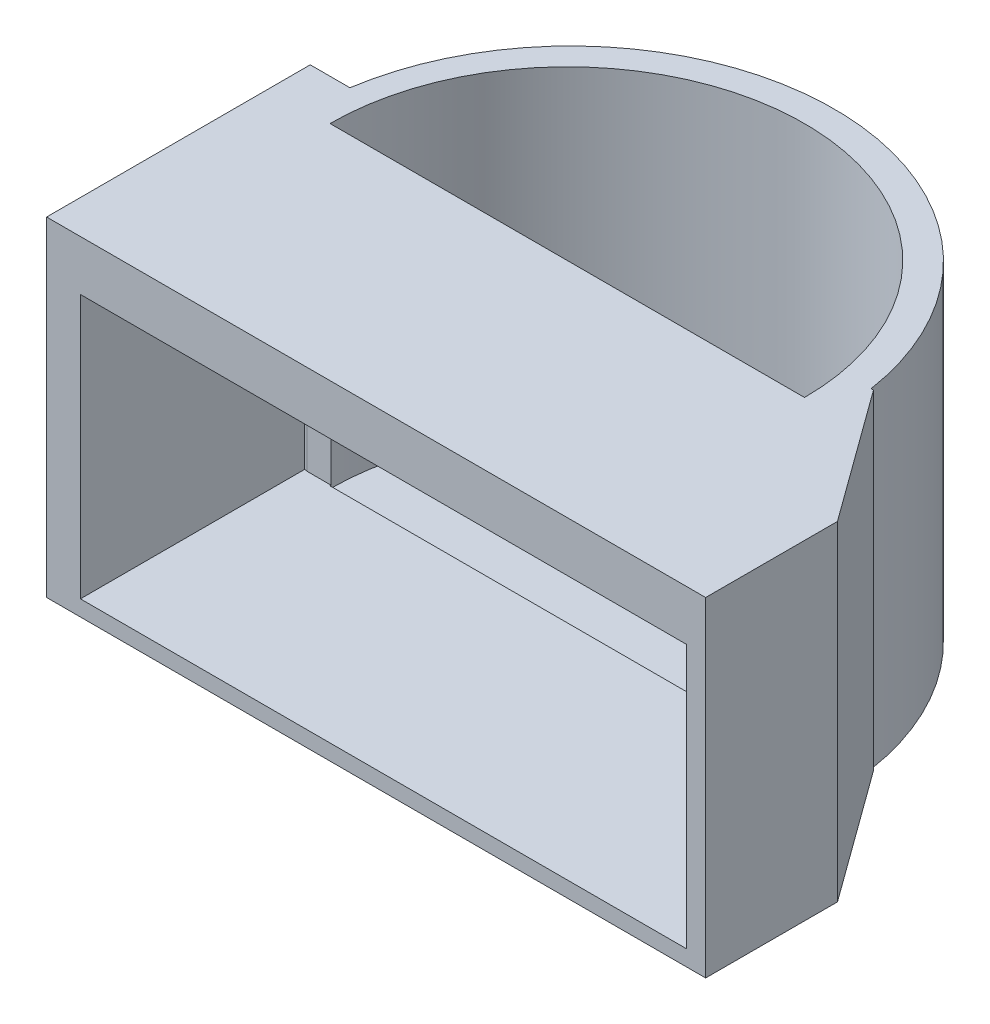
ISO-10303-21;
HEADER;
FILE_DESCRIPTION(('STEP AP214'),'2;1');
FILE_NAME('part.step','',(''),(''),'','','');
FILE_SCHEMA(('AUTOMOTIVE_DESIGN { 1 0 10303 214 1 1 1 1 }'));
ENDSEC;
DATA;
#1=APPLICATION_CONTEXT('core data for automotive mechanical design processes');
#2=APPLICATION_PROTOCOL_DEFINITION('international standard','automotive_design',2000,#1);
#3=PRODUCT_CONTEXT('',#1,'mechanical');
#4=PRODUCT('Part','Part','',(#3));
#5=PRODUCT_RELATED_PRODUCT_CATEGORY('part','',(#4));
#6=PRODUCT_DEFINITION_FORMATION('','',#4);
#7=PRODUCT_DEFINITION_CONTEXT('part definition',#1,'design');
#8=PRODUCT_DEFINITION('design','',#6,#7);
#9=PRODUCT_DEFINITION_SHAPE('','',#8);
#10=(LENGTH_UNIT() NAMED_UNIT(*) SI_UNIT(.MILLI.,.METRE.));
#11=(NAMED_UNIT(*) PLANE_ANGLE_UNIT() SI_UNIT($,.RADIAN.));
#12=(NAMED_UNIT(*) SI_UNIT($,.STERADIAN.) SOLID_ANGLE_UNIT());
#13=UNCERTAINTY_MEASURE_WITH_UNIT(LENGTH_MEASURE(1.E-05),#10,'distance_accuracy_value','');
#14=(GEOMETRIC_REPRESENTATION_CONTEXT(3) GLOBAL_UNCERTAINTY_ASSIGNED_CONTEXT((#13)) GLOBAL_UNIT_ASSIGNED_CONTEXT((#10,
#11,#12)) REPRESENTATION_CONTEXT('',''));
#15=CARTESIAN_POINT('',(0.,0.,0.));
#16=DIRECTION('',(0.,0.,1.));
#17=DIRECTION('',(1.,0.,0.));
#18=AXIS2_PLACEMENT_3D('',#15,#16,#17);
#19=CARTESIAN_POINT('',(-22.2170438921533,25.,-6.97627056206323));
#20=DIRECTION('',(0.,0.,1.));
#21=DIRECTION('',(1.,0.,0.));
#22=AXIS2_PLACEMENT_3D('',#19,#20,#21);
#23=PLANE('',#22);
#24=DIRECTION('',(-1.,0.,0.));
#25=VECTOR('',#24,1.);
#26=CARTESIAN_POINT('',(23.5649533214157,1.19361020714787,-6.97627056206323));
#27=LINE('',#26,#25);
#28=CARTESIAN_POINT('',(16.3167684871887,1.19361020714787,-6.97627056206323));
#29=VERTEX_POINT('',#28);
#30=CARTESIAN_POINT('',(15.6079428709197,1.19361020714787,-6.97627056206323));
#31=VERTEX_POINT('',#30);
#32=EDGE_CURVE('E298',#29,#31,#27,.T.);
#33=ORIENTED_EDGE('',*,*,#32,.F.);
#34=DIRECTION('',(0.,-1.,0.));
#35=VECTOR('',#34,1.);
#36=CARTESIAN_POINT('',(16.3167684871887,25.,-6.97627056206323));
#37=LINE('',#36,#35);
#38=CARTESIAN_POINT('',(16.3167684871887,21.1936102071479,-6.97627056206323));
#39=VERTEX_POINT('',#38);
#40=EDGE_CURVE('E11',#29,#39,#37,.F.);
#41=ORIENTED_EDGE('',*,*,#40,.T.);
#42=DIRECTION('',(1.,0.,0.));
#43=VECTOR('',#42,1.);
#44=CARTESIAN_POINT('',(23.5649533214157,21.1936102071479,-6.97627056206323));
#45=LINE('',#44,#43);
#46=CARTESIAN_POINT('',(15.6079428709197,21.1936102071479,-6.97627056206323));
#47=VERTEX_POINT('',#46);
#48=EDGE_CURVE('E233',#47,#39,#45,.T.);
#49=ORIENTED_EDGE('',*,*,#48,.F.);
#50=DIRECTION('',(0.,1.,0.));
#51=VECTOR('',#50,1.);
#52=CARTESIAN_POINT('',(15.6079428709197,1.,-6.97627056206323));
#53=LINE('',#52,#51);
#54=EDGE_CURVE('E302',#31,#47,#53,.T.);
#55=ORIENTED_EDGE('',*,*,#54,.F.);
#56=EDGE_LOOP('',(#33,#41,#49,#55));
#57=FACE_BOUND('',#56,.T.);
#58=ADVANCED_FACE('F39',(#57),#23,.T.);
#59=CARTESIAN_POINT('',(-25.,25.,-10.));
#60=DIRECTION('',(0.,0.,1.));
#61=DIRECTION('',(1.,0.,0.));
#62=AXIS2_PLACEMENT_3D('',#59,#60,#61);
#63=PLANE('',#62);
#64=DIRECTION('',(-1.,0.,0.));
#65=VECTOR('',#64,1.);
#66=CARTESIAN_POINT('',(-25.,25.,-10.));
#67=LINE('',#66,#65);
#68=CARTESIAN_POINT('',(-21.9871491090244,25.,-10.));
#69=VERTEX_POINT('',#68);
#70=CARTESIAN_POINT('',(-25.,25.,-10.));
#71=VERTEX_POINT('',#70);
#72=EDGE_CURVE('E269',#69,#71,#67,.T.);
#73=ORIENTED_EDGE('',*,*,#72,.F.);
#74=DIRECTION('',(0.,-1.,0.));
#75=VECTOR('',#74,1.);
#76=CARTESIAN_POINT('',(-21.9871491090244,25.,-10.));
#77=LINE('',#76,#75);
#78=CARTESIAN_POINT('',(-21.9871491090244,0.,-10.));
#79=VERTEX_POINT('',#78);
#80=EDGE_CURVE('E230',#69,#79,#77,.T.);
#81=ORIENTED_EDGE('',*,*,#80,.T.);
#82=DIRECTION('',(-1.,0.,0.));
#83=VECTOR('',#82,1.);
#84=CARTESIAN_POINT('',(-25.,0.,-10.));
#85=LINE('',#84,#83);
#86=CARTESIAN_POINT('',(-25.,0.,-10.));
#87=VERTEX_POINT('',#86);
#88=EDGE_CURVE('E280',#79,#87,#85,.T.);
#89=ORIENTED_EDGE('',*,*,#88,.T.);
#90=DIRECTION('',(0.,-1.,0.));
#91=VECTOR('',#90,1.);
#92=CARTESIAN_POINT('',(-25.,25.,-10.));
#93=LINE('',#92,#91);
#94=EDGE_CURVE('E291',#71,#87,#93,.T.);
#95=ORIENTED_EDGE('',*,*,#94,.F.);
#96=EDGE_LOOP('',(#73,#81,#89,#95));
#97=FACE_BOUND('',#96,.T.);
#98=ADVANCED_FACE('F377',(#97),#63,.F.);
#99=CARTESIAN_POINT('',(25.,25.,10.));
#100=DIRECTION('',(-1.,0.,0.));
#101=DIRECTION('',(0.,0.,1.));
#102=AXIS2_PLACEMENT_3D('',#99,#100,#101);
#103=PLANE('',#102);
#104=DIRECTION('',(0.,0.,-1.));
#105=VECTOR('',#104,1.);
#106=CARTESIAN_POINT('',(25.,0.,10.));
#107=LINE('',#106,#105);
#108=CARTESIAN_POINT('',(25.,0.,10.));
#109=VERTEX_POINT('',#108);
#110=CARTESIAN_POINT('',(25.,0.,0.));
#111=VERTEX_POINT('',#110);
#112=EDGE_CURVE('E259',#109,#111,#107,.T.);
#113=ORIENTED_EDGE('',*,*,#112,.T.);
#114=DIRECTION('',(0.,1.,0.));
#115=VECTOR('',#114,1.);
#116=CARTESIAN_POINT('',(25.,25.,0.));
#117=LINE('',#116,#115);
#118=CARTESIAN_POINT('',(25.,25.,0.));
#119=VERTEX_POINT('',#118);
#120=EDGE_CURVE('E311',#111,#119,#117,.T.);
#121=ORIENTED_EDGE('',*,*,#120,.T.);
#122=DIRECTION('',(0.,0.,-1.));
#123=VECTOR('',#122,1.);
#124=CARTESIAN_POINT('',(25.,25.,10.));
#125=LINE('',#124,#123);
#126=CARTESIAN_POINT('',(25.,25.,10.));
#127=VERTEX_POINT('',#126);
#128=EDGE_CURVE('E266',#127,#119,#125,.T.);
#129=ORIENTED_EDGE('',*,*,#128,.F.);
#130=DIRECTION('',(0.,-1.,0.));
#131=VECTOR('',#130,1.);
#132=CARTESIAN_POINT('',(25.,25.,10.));
#133=LINE('',#132,#131);
#134=EDGE_CURVE('E277',#127,#109,#133,.T.);
#135=ORIENTED_EDGE('',*,*,#134,.T.);
#136=EDGE_LOOP('',(#113,#121,#129,#135));
#137=FACE_BOUND('',#136,.T.);
#138=ADVANCED_FACE('F382',(#137),#103,.F.);
#139=CARTESIAN_POINT('',(17.7345747199464,25.,-10.));
#140=VERTEX_POINT('',#139);
#141=CARTESIAN_POINT('',(17.5530613247178,25.,-10.));
#142=VERTEX_POINT('',#141);
#143=EDGE_CURVE('E271',#140,#142,#67,.T.);
#144=ORIENTED_EDGE('',*,*,#143,.F.);
#145=DIRECTION('',(0.,-1.,0.));
#146=VECTOR('',#145,1.);
#147=CARTESIAN_POINT('',(17.7345747199464,25.,-10.));
#148=LINE('',#147,#146);
#149=CARTESIAN_POINT('',(17.7345747199464,0.,-10.));
#150=VERTEX_POINT('',#149);
#151=EDGE_CURVE('E306',#140,#150,#148,.T.);
#152=ORIENTED_EDGE('',*,*,#151,.T.);
#153=CARTESIAN_POINT('',(17.5530613247178,0.,-10.));
#154=VERTEX_POINT('',#153);
#155=EDGE_CURVE('E281',#150,#154,#85,.T.);
#156=ORIENTED_EDGE('',*,*,#155,.T.);
#157=DIRECTION('',(0.,-1.,0.));
#158=VECTOR('',#157,1.);
#159=CARTESIAN_POINT('',(17.5530613247178,25.,-10.));
#160=LINE('',#159,#158);
#161=EDGE_CURVE('E227',#154,#142,#160,.F.);
#162=ORIENTED_EDGE('',*,*,#161,.T.);
#163=EDGE_LOOP('',(#144,#152,#156,#162));
#164=FACE_BOUND('',#163,.T.);
#165=ADVANCED_FACE('F385',(#164),#63,.F.);
#166=CARTESIAN_POINT('',(-25.,25.,10.));
#167=DIRECTION('',(1.,0.,0.));
#168=DIRECTION('',(0.,0.,-1.));
#169=AXIS2_PLACEMENT_3D('',#166,#167,#168);
#170=PLANE('',#169);
#171=DIRECTION('',(0.,0.,1.));
#172=VECTOR('',#171,1.);
#173=CARTESIAN_POINT('',(-25.,0.,10.));
#174=LINE('',#173,#172);
#175=CARTESIAN_POINT('',(-25.,0.,10.));
#176=VERTEX_POINT('',#175);
#177=EDGE_CURVE('E283',#87,#176,#174,.T.);
#178=ORIENTED_EDGE('',*,*,#177,.T.);
#179=DIRECTION('',(0.,-1.,0.));
#180=VECTOR('',#179,1.);
#181=CARTESIAN_POINT('',(-25.,25.,10.));
#182=LINE('',#181,#180);
#183=CARTESIAN_POINT('',(-25.,25.,10.));
#184=VERTEX_POINT('',#183);
#185=EDGE_CURVE('E288',#184,#176,#182,.T.);
#186=ORIENTED_EDGE('',*,*,#185,.F.);
#187=DIRECTION('',(0.,0.,1.));
#188=VECTOR('',#187,1.);
#189=CARTESIAN_POINT('',(-25.,25.,10.));
#190=LINE('',#189,#188);
#191=EDGE_CURVE('E273',#71,#184,#190,.T.);
#192=ORIENTED_EDGE('',*,*,#191,.F.);
#193=ORIENTED_EDGE('',*,*,#94,.T.);
#194=EDGE_LOOP('',(#178,#186,#192,#193));
#195=FACE_BOUND('',#194,.T.);
#196=ADVANCED_FACE('F484',(#195),#170,.F.);
#197=CARTESIAN_POINT('',(-25.,25.,10.));
#198=DIRECTION('',(0.,0.,-1.));
#199=DIRECTION('',(-1.,0.,0.));
#200=AXIS2_PLACEMENT_3D('',#197,#198,#199);
#201=PLANE('',#200);
#202=DIRECTION('',(1.,0.,0.));
#203=VECTOR('',#202,1.);
#204=CARTESIAN_POINT('',(23.5649533214157,1.19361020714787,10.));
#205=LINE('',#204,#203);
#206=CARTESIAN_POINT('',(-22.4350466785843,1.19361020714787,10.));
#207=VERTEX_POINT('',#206);
#208=CARTESIAN_POINT('',(23.5649533214157,1.19361020714787,10.));
#209=VERTEX_POINT('',#208);
#210=EDGE_CURVE('E249',#207,#209,#205,.T.);
#211=ORIENTED_EDGE('',*,*,#210,.F.);
#212=DIRECTION('',(0.,-1.,0.));
#213=VECTOR('',#212,1.);
#214=CARTESIAN_POINT('',(-22.4350466785843,21.1936102071479,10.));
#215=LINE('',#214,#213);
#216=CARTESIAN_POINT('',(-22.4350466785843,21.1936102071479,10.));
#217=VERTEX_POINT('',#216);
#218=EDGE_CURVE('E237',#217,#207,#215,.T.);
#219=ORIENTED_EDGE('',*,*,#218,.F.);
#220=DIRECTION('',(-1.,0.,0.));
#221=VECTOR('',#220,1.);
#222=CARTESIAN_POINT('',(23.5649533214157,21.1936102071479,10.));
#223=LINE('',#222,#221);
#224=CARTESIAN_POINT('',(23.5649533214157,21.1936102071479,10.));
#225=VERTEX_POINT('',#224);
#226=EDGE_CURVE('E242',#225,#217,#223,.T.);
#227=ORIENTED_EDGE('',*,*,#226,.F.);
#228=DIRECTION('',(0.,1.,0.));
#229=VECTOR('',#228,1.);
#230=CARTESIAN_POINT('',(23.5649533214157,21.1936102071479,10.));
#231=LINE('',#230,#229);
#232=EDGE_CURVE('E252',#209,#225,#231,.T.);
#233=ORIENTED_EDGE('',*,*,#232,.F.);
#234=EDGE_LOOP('',(#211,#219,#227,#233));
#235=FACE_BOUND('',#234,.T.);
#236=DIRECTION('',(1.,0.,0.));
#237=VECTOR('',#236,1.);
#238=CARTESIAN_POINT('',(-25.,0.,10.));
#239=LINE('',#238,#237);
#240=EDGE_CURVE('E270',#176,#109,#239,.T.);
#241=ORIENTED_EDGE('',*,*,#240,.T.);
#242=ORIENTED_EDGE('',*,*,#134,.F.);
#243=DIRECTION('',(1.,0.,0.));
#244=VECTOR('',#243,1.);
#245=CARTESIAN_POINT('',(-25.,25.,10.));
#246=LINE('',#245,#244);
#247=EDGE_CURVE('E275',#184,#127,#246,.T.);
#248=ORIENTED_EDGE('',*,*,#247,.F.);
#249=ORIENTED_EDGE('',*,*,#185,.T.);
#250=EDGE_LOOP('',(#241,#242,#248,#249));
#251=FACE_BOUND('',#250,.T.);
#252=ADVANCED_FACE('F329',(#235,#251),#201,.F.);
#253=CARTESIAN_POINT('',(0.,25.,0.));
#254=DIRECTION('',(0.,-1.,0.));
#255=DIRECTION('',(0.,0.,-1.));
#256=AXIS2_PLACEMENT_3D('',#253,#254,#255);
#257=PLANE('',#256);
#258=DIRECTION('',(1.,0.,0.));
#259=VECTOR('',#258,1.);
#260=CARTESIAN_POINT('',(-20.3918641927074,25.,-6.89292986253043));
#261=LINE('',#260,#259);
#262=CARTESIAN_POINT('',(-20.3918641927074,25.,-6.89292986253043));
#263=VERTEX_POINT('',#262);
#264=CARTESIAN_POINT('',(15.6081358072926,25.,-6.89292986253043));
#265=VERTEX_POINT('',#264);
#266=EDGE_CURVE('E191',#263,#265,#261,.T.);
#267=ORIENTED_EDGE('',*,*,#266,.F.);
#268=CARTESIAN_POINT('',(-2.39186419270742,25.,-6.89292986253039));
#269=DIRECTION('',(0.,1.,0.));
#270=DIRECTION('',(0.,0.,-1.));
#271=AXIS2_PLACEMENT_3D('',#268,#269,#270);
#272=CIRCLE('',#271,18.);
#273=EDGE_CURVE('E198',#265,#263,#272,.T.);
#274=ORIENTED_EDGE('',*,*,#273,.F.);
#275=EDGE_LOOP('',(#267,#274));
#276=FACE_BOUND('',#275,.T.);
#277=ORIENTED_EDGE('',*,*,#128,.T.);
#278=DIRECTION('',(0.587785252292472,0.,0.809016994374948));
#279=VECTOR('',#278,1.);
#280=CARTESIAN_POINT('',(17.7345747199464,25.,-10.));
#281=LINE('',#280,#279);
#282=EDGE_CURVE('E313',#119,#140,#281,.F.);
#283=ORIENTED_EDGE('',*,*,#282,.T.);
#284=ORIENTED_EDGE('',*,*,#143,.T.);
#285=CARTESIAN_POINT('',(-2.21704389215329,25.,-6.97627056206323));
#286=DIRECTION('',(0.,-1.,0.));
#287=DIRECTION('',(0.,0.,-1.));
#288=AXIS2_PLACEMENT_3D('',#285,#286,#287);
#289=CIRCLE('',#288,20.);
#290=EDGE_CURVE('E213',#69,#142,#289,.T.);
#291=ORIENTED_EDGE('',*,*,#290,.F.);
#292=ORIENTED_EDGE('',*,*,#72,.T.);
#293=ORIENTED_EDGE('',*,*,#191,.T.);
#294=ORIENTED_EDGE('',*,*,#247,.T.);
#295=EDGE_LOOP('',(#277,#283,#284,#291,#292,#293,#294));
#296=FACE_BOUND('',#295,.T.);
#297=ADVANCED_FACE('F350',(#276,#296),#257,.F.);
#298=CARTESIAN_POINT('',(0.,0.,0.));
#299=DIRECTION('',(0.,-1.,0.));
#300=DIRECTION('',(0.,0.,-1.));
#301=AXIS2_PLACEMENT_3D('',#298,#299,#300);
#302=PLANE('',#301);
#303=ORIENTED_EDGE('',*,*,#155,.F.);
#304=DIRECTION('',(-0.587785252292472,0.,-0.809016994374948));
#305=VECTOR('',#304,1.);
#306=CARTESIAN_POINT('',(16.3627124296869,0.,-11.8882064536894));
#307=LINE('',#306,#305);
#308=EDGE_CURVE('E309',#150,#111,#307,.F.);
#309=ORIENTED_EDGE('',*,*,#308,.T.);
#310=ORIENTED_EDGE('',*,*,#112,.F.);
#311=ORIENTED_EDGE('',*,*,#240,.F.);
#312=ORIENTED_EDGE('',*,*,#177,.F.);
#313=ORIENTED_EDGE('',*,*,#88,.F.);
#314=CARTESIAN_POINT('',(-2.21704389215329,0.,-6.97627056206323));
#315=DIRECTION('',(0.,-1.,0.));
#316=DIRECTION('',(0.,0.,-1.));
#317=AXIS2_PLACEMENT_3D('',#314,#315,#316);
#318=CIRCLE('',#317,20.);
#319=EDGE_CURVE('E212',#79,#154,#318,.T.);
#320=ORIENTED_EDGE('',*,*,#319,.T.);
#321=EDGE_LOOP('',(#303,#309,#310,#311,#312,#313,#320));
#322=FACE_BOUND('',#321,.T.);
#323=ADVANCED_FACE('F365',(#322),#302,.T.);
#324=CARTESIAN_POINT('',(-22.4350466785843,21.1936102071479,-7.));
#325=DIRECTION('',(-1.,0.,0.));
#326=DIRECTION('',(0.,0.,1.));
#327=AXIS2_PLACEMENT_3D('',#324,#325,#326);
#328=PLANE('',#327);
#329=ORIENTED_EDGE('',*,*,#218,.T.);
#330=DIRECTION('',(0.,0.,1.));
#331=VECTOR('',#330,1.);
#332=CARTESIAN_POINT('',(-22.4350466785843,1.19361020714787,-7.));
#333=LINE('',#332,#331);
#334=CARTESIAN_POINT('',(-22.4350466785843,1.19361020714787,-7.));
#335=VERTEX_POINT('',#334);
#336=EDGE_CURVE('E247',#335,#207,#333,.T.);
#337=ORIENTED_EDGE('',*,*,#336,.F.);
#338=DIRECTION('',(0.,-1.,0.));
#339=VECTOR('',#338,1.);
#340=CARTESIAN_POINT('',(-22.4350466785843,21.1936102071479,-7.));
#341=LINE('',#340,#339);
#342=CARTESIAN_POINT('',(-22.4350466785843,21.1936102071479,-7.));
#343=VERTEX_POINT('',#342);
#344=EDGE_CURVE('E238',#343,#335,#341,.T.);
#345=ORIENTED_EDGE('',*,*,#344,.F.);
#346=DIRECTION('',(0.,0.,1.));
#347=VECTOR('',#346,1.);
#348=CARTESIAN_POINT('',(-22.4350466785843,21.1936102071479,-7.));
#349=LINE('',#348,#347);
#350=EDGE_CURVE('E257',#343,#217,#349,.T.);
#351=ORIENTED_EDGE('',*,*,#350,.T.);
#352=EDGE_LOOP('',(#329,#337,#345,#351));
#353=FACE_BOUND('',#352,.T.);
#354=ADVANCED_FACE('F363',(#353),#328,.F.);
#355=CARTESIAN_POINT('',(23.5649533214157,21.1936102071479,-7.));
#356=DIRECTION('',(0.,1.,0.));
#357=DIRECTION('',(-1.,0.,0.));
#358=AXIS2_PLACEMENT_3D('',#355,#356,#357);
#359=PLANE('',#358);
#360=ORIENTED_EDGE('',*,*,#48,.T.);
#361=DIRECTION('',(-0.587785252292478,0.,-0.809016994374944));
#362=VECTOR('',#361,1.);
#363=CARTESIAN_POINT('',(16.299528041362,21.1936102071479,-7.));
#364=LINE('',#363,#362);
#365=CARTESIAN_POINT('',(23.5649533214157,21.1936102071479,3.00000000000005));
#366=VERTEX_POINT('',#365);
#367=EDGE_CURVE('E315',#39,#366,#364,.F.);
#368=ORIENTED_EDGE('',*,*,#367,.T.);
#369=DIRECTION('',(0.,0.,1.));
#370=VECTOR('',#369,1.);
#371=CARTESIAN_POINT('',(23.5649533214157,21.1936102071479,-7.));
#372=LINE('',#371,#370);
#373=EDGE_CURVE('E260',#366,#225,#372,.T.);
#374=ORIENTED_EDGE('',*,*,#373,.T.);
#375=ORIENTED_EDGE('',*,*,#226,.T.);
#376=ORIENTED_EDGE('',*,*,#350,.F.);
#377=DIRECTION('',(-1.,0.,0.));
#378=VECTOR('',#377,1.);
#379=CARTESIAN_POINT('',(23.5649533214157,21.1936102071479,-7.));
#380=LINE('',#379,#378);
#381=CARTESIAN_POINT('',(-22.2170298149927,21.1936102071479,-7.));
#382=VERTEX_POINT('',#381);
#383=EDGE_CURVE('E245',#382,#343,#380,.T.);
#384=ORIENTED_EDGE('',*,*,#383,.F.);
#385=CARTESIAN_POINT('',(-2.21704389215329,21.1936102071479,-6.97627056206323));
#386=DIRECTION('',(0.,1.,0.));
#387=DIRECTION('',(-1.,0.,0.));
#388=AXIS2_PLACEMENT_3D('',#385,#386,#387);
#389=CIRCLE('',#388,20.);
#390=CARTESIAN_POINT('',(-22.2170438921533,21.1936102071479,-6.97627056206323));
#391=VERTEX_POINT('',#390);
#392=EDGE_CURVE('E224',#382,#391,#389,.T.);
#393=ORIENTED_EDGE('',*,*,#392,.T.);
#394=CARTESIAN_POINT('',(-20.3916712563346,21.1936102071479,-6.97627056206323));
#395=VERTEX_POINT('',#394);
#396=EDGE_CURVE('E234',#391,#395,#45,.T.);
#397=ORIENTED_EDGE('',*,*,#396,.T.);
#398=CARTESIAN_POINT('',(-2.39186419270742,21.1936102071479,-6.89292986253039));
#399=DIRECTION('',(0.,1.,0.));
#400=DIRECTION('',(-1.,0.,0.));
#401=AXIS2_PLACEMENT_3D('',#398,#399,#400);
#402=CIRCLE('',#401,18.);
#403=CARTESIAN_POINT('',(-20.3918641927074,21.1936102071479,-6.89292986253043));
#404=VERTEX_POINT('',#403);
#405=EDGE_CURVE('E204',#395,#404,#402,.T.);
#406=ORIENTED_EDGE('',*,*,#405,.T.);
#407=DIRECTION('',(1.,0.,0.));
#408=VECTOR('',#407,1.);
#409=CARTESIAN_POINT('',(23.5649533214157,21.1936102071479,-6.89292986253043));
#410=LINE('',#409,#408);
#411=CARTESIAN_POINT('',(15.6081358072926,21.1936102071479,-6.89292986253043));
#412=VERTEX_POINT('',#411);
#413=EDGE_CURVE('E209',#404,#412,#410,.T.);
#414=ORIENTED_EDGE('',*,*,#413,.T.);
#415=EDGE_CURVE('E208',#412,#47,#402,.T.);
#416=ORIENTED_EDGE('',*,*,#415,.T.);
#417=EDGE_LOOP('',(#360,#368,#374,#375,#376,#384,#393,#397,#406,#414,#416));
#418=FACE_BOUND('',#417,.T.);
#419=ADVANCED_FACE('F334',(#418),#359,.F.);
#420=CARTESIAN_POINT('',(23.5649533214157,21.1936102071479,-7.));
#421=DIRECTION('',(1.,0.,0.));
#422=DIRECTION('',(0.,0.,-1.));
#423=AXIS2_PLACEMENT_3D('',#420,#421,#422);
#424=PLANE('',#423);
#425=ORIENTED_EDGE('',*,*,#373,.F.);
#426=DIRECTION('',(0.,-1.,0.));
#427=VECTOR('',#426,1.);
#428=CARTESIAN_POINT('',(23.5649533214157,1.19361020714787,3.00000000000005));
#429=LINE('',#428,#427);
#430=CARTESIAN_POINT('',(23.5649533214157,1.19361020714787,3.00000000000005));
#431=VERTEX_POINT('',#430);
#432=EDGE_CURVE('E317',#366,#431,#429,.T.);
#433=ORIENTED_EDGE('',*,*,#432,.T.);
#434=DIRECTION('',(0.,0.,1.));
#435=VECTOR('',#434,1.);
#436=CARTESIAN_POINT('',(23.5649533214157,1.19361020714787,-7.));
#437=LINE('',#436,#435);
#438=EDGE_CURVE('E262',#431,#209,#437,.T.);
#439=ORIENTED_EDGE('',*,*,#438,.T.);
#440=ORIENTED_EDGE('',*,*,#232,.T.);
#441=EDGE_LOOP('',(#425,#433,#439,#440));
#442=FACE_BOUND('',#441,.T.);
#443=ADVANCED_FACE('F320',(#442),#424,.F.);
#444=CARTESIAN_POINT('',(23.5649533214157,1.19361020714787,-7.));
#445=DIRECTION('',(0.,-1.,0.));
#446=DIRECTION('',(1.,0.,0.));
#447=AXIS2_PLACEMENT_3D('',#444,#445,#446);
#448=PLANE('',#447);
#449=ORIENTED_EDGE('',*,*,#438,.F.);
#450=DIRECTION('',(0.587785252292478,0.,0.809016994374944));
#451=VECTOR('',#450,1.);
#452=CARTESIAN_POINT('',(16.299528041362,1.19361020714787,-7.));
#453=LINE('',#452,#451);
#454=EDGE_CURVE('E47',#431,#29,#453,.F.);
#455=ORIENTED_EDGE('',*,*,#454,.T.);
#456=ORIENTED_EDGE('',*,*,#32,.T.);
#457=CARTESIAN_POINT('',(-2.39186419270742,1.19361020714787,-6.89292986253039));
#458=DIRECTION('',(0.,-1.,0.));
#459=DIRECTION('',(1.,0.,0.));
#460=AXIS2_PLACEMENT_3D('',#457,#458,#459);
#461=CIRCLE('',#460,18.);
#462=CARTESIAN_POINT('',(15.6081358072926,1.19361020714787,-6.89292986253043));
#463=VERTEX_POINT('',#462);
#464=EDGE_CURVE('E205',#31,#463,#461,.T.);
#465=ORIENTED_EDGE('',*,*,#464,.T.);
#466=DIRECTION('',(-1.,0.,0.));
#467=VECTOR('',#466,1.);
#468=CARTESIAN_POINT('',(23.5649533214157,1.19361020714787,-6.89292986253043));
#469=LINE('',#468,#467);
#470=CARTESIAN_POINT('',(-20.3918641927074,1.19361020714787,-6.89292986253043));
#471=VERTEX_POINT('',#470);
#472=EDGE_CURVE('E304',#463,#471,#469,.T.);
#473=ORIENTED_EDGE('',*,*,#472,.T.);
#474=CARTESIAN_POINT('',(-20.3916712563346,1.19361020714787,-6.97627056206323));
#475=VERTEX_POINT('',#474);
#476=EDGE_CURVE('E181',#471,#475,#461,.T.);
#477=ORIENTED_EDGE('',*,*,#476,.T.);
#478=CARTESIAN_POINT('',(-22.2170438921533,1.19361020714787,-6.97627056206323));
#479=VERTEX_POINT('',#478);
#480=EDGE_CURVE('E297',#475,#479,#27,.T.);
#481=ORIENTED_EDGE('',*,*,#480,.T.);
#482=CARTESIAN_POINT('',(-2.21704389215329,1.19361020714787,-6.97627056206323));
#483=DIRECTION('',(0.,-1.,0.));
#484=DIRECTION('',(1.,0.,0.));
#485=AXIS2_PLACEMENT_3D('',#482,#483,#484);
#486=CIRCLE('',#485,20.);
#487=CARTESIAN_POINT('',(-22.2170298149927,1.19361020714787,-7.));
#488=VERTEX_POINT('',#487);
#489=EDGE_CURVE('E221',#479,#488,#486,.T.);
#490=ORIENTED_EDGE('',*,*,#489,.T.);
#491=DIRECTION('',(1.,0.,0.));
#492=VECTOR('',#491,1.);
#493=CARTESIAN_POINT('',(23.5649533214157,1.19361020714787,-7.));
#494=LINE('',#493,#492);
#495=EDGE_CURVE('E241',#335,#488,#494,.T.);
#496=ORIENTED_EDGE('',*,*,#495,.F.);
#497=ORIENTED_EDGE('',*,*,#336,.T.);
#498=ORIENTED_EDGE('',*,*,#210,.T.);
#499=EDGE_LOOP('',(#449,#455,#456,#465,#473,#477,#481,#490,#496,#497,#498));
#500=FACE_BOUND('',#499,.T.);
#501=ADVANCED_FACE('F322',(#500),#448,.F.);
#502=CARTESIAN_POINT('',(0.,0.,-7.));
#503=DIRECTION('',(0.,0.,-1.));
#504=DIRECTION('',(-1.,0.,0.));
#505=AXIS2_PLACEMENT_3D('',#502,#503,#504);
#506=PLANE('',#505);
#507=ORIENTED_EDGE('',*,*,#495,.T.);
#508=DIRECTION('',(0.,-1.,0.));
#509=VECTOR('',#508,1.);
#510=CARTESIAN_POINT('',(-22.2170298149927,25.,-7.));
#511=LINE('',#510,#509);
#512=EDGE_CURVE('E294',#488,#382,#511,.F.);
#513=ORIENTED_EDGE('',*,*,#512,.T.);
#514=ORIENTED_EDGE('',*,*,#383,.T.);
#515=ORIENTED_EDGE('',*,*,#344,.T.);
#516=EDGE_LOOP('',(#507,#513,#514,#515));
#517=FACE_BOUND('',#516,.T.);
#518=ADVANCED_FACE('F361',(#517),#506,.F.);
#519=CARTESIAN_POINT('',(-2.21704389215329,25.,-6.97627056206323));
#520=DIRECTION('',(0.,-1.,0.));
#521=DIRECTION('',(0.,0.,-1.));
#522=AXIS2_PLACEMENT_3D('',#519,#520,#521);
#523=CYLINDRICAL_SURFACE('',#522,20.);
#524=ORIENTED_EDGE('',*,*,#392,.F.);
#525=ORIENTED_EDGE('',*,*,#512,.F.);
#526=ORIENTED_EDGE('',*,*,#489,.F.);
#527=DIRECTION('',(0.,-1.,0.));
#528=VECTOR('',#527,1.);
#529=CARTESIAN_POINT('',(-22.2170438921533,25.,-6.97627056206323));
#530=LINE('',#529,#528);
#531=EDGE_CURVE('E216',#391,#479,#530,.T.);
#532=ORIENTED_EDGE('',*,*,#531,.F.);
#533=EDGE_LOOP('',(#524,#525,#526,#532));
#534=FACE_BOUND('',#533,.T.);
#535=ADVANCED_FACE('F359',(#534),#523,.T.);
#536=DIRECTION('',(0.,1.,0.));
#537=VECTOR('',#536,1.);
#538=CARTESIAN_POINT('',(-20.3916712563346,1.,-6.97627056206323));
#539=LINE('',#538,#537);
#540=EDGE_CURVE('E300',#395,#475,#539,.F.);
#541=ORIENTED_EDGE('',*,*,#540,.F.);
#542=ORIENTED_EDGE('',*,*,#396,.F.);
#543=ORIENTED_EDGE('',*,*,#531,.T.);
#544=ORIENTED_EDGE('',*,*,#480,.F.);
#545=EDGE_LOOP('',(#541,#542,#543,#544));
#546=FACE_BOUND('',#545,.T.);
#547=ADVANCED_FACE('F355',(#546),#23,.T.);
#548=ORIENTED_EDGE('',*,*,#80,.F.);
#549=ORIENTED_EDGE('',*,*,#290,.T.);
#550=ORIENTED_EDGE('',*,*,#161,.F.);
#551=ORIENTED_EDGE('',*,*,#319,.F.);
#552=EDGE_LOOP('',(#548,#549,#550,#551));
#553=FACE_BOUND('',#552,.T.);
#554=ADVANCED_FACE('F389',(#553),#523,.T.);
#555=CARTESIAN_POINT('',(-20.3918641927074,1.,-6.89292986253043));
#556=DIRECTION('',(0.,0.,1.));
#557=DIRECTION('',(1.,0.,0.));
#558=AXIS2_PLACEMENT_3D('',#555,#556,#557);
#559=PLANE('',#558);
#560=DIRECTION('',(0.,1.,0.));
#561=VECTOR('',#560,1.);
#562=CARTESIAN_POINT('',(-20.3918641927074,1.,-6.89292986253043));
#563=LINE('',#562,#561);
#564=EDGE_CURVE('E186',#404,#263,#563,.T.);
#565=ORIENTED_EDGE('',*,*,#564,.T.);
#566=ORIENTED_EDGE('',*,*,#266,.T.);
#567=DIRECTION('',(0.,1.,0.));
#568=VECTOR('',#567,1.);
#569=CARTESIAN_POINT('',(15.6081358072926,1.,-6.89292986253043));
#570=LINE('',#569,#568);
#571=EDGE_CURVE('E185',#412,#265,#570,.T.);
#572=ORIENTED_EDGE('',*,*,#571,.F.);
#573=ORIENTED_EDGE('',*,*,#413,.F.);
#574=EDGE_LOOP('',(#565,#566,#572,#573));
#575=FACE_BOUND('',#574,.T.);
#576=ADVANCED_FACE('F345',(#575),#559,.F.);
#577=CARTESIAN_POINT('',(15.6081358072926,1.,-6.89292986253043));
#578=VERTEX_POINT('',#577);
#579=EDGE_CURVE('E194',#578,#463,#570,.T.);
#580=ORIENTED_EDGE('',*,*,#579,.F.);
#581=DIRECTION('',(1.,0.,0.));
#582=VECTOR('',#581,1.);
#583=CARTESIAN_POINT('',(-20.3918641927074,1.,-6.89292986253043));
#584=LINE('',#583,#582);
#585=CARTESIAN_POINT('',(-20.3918641927074,1.,-6.89292986253043));
#586=VERTEX_POINT('',#585);
#587=EDGE_CURVE('E190',#586,#578,#584,.T.);
#588=ORIENTED_EDGE('',*,*,#587,.F.);
#589=EDGE_CURVE('E174',#586,#471,#563,.T.);
#590=ORIENTED_EDGE('',*,*,#589,.T.);
#591=ORIENTED_EDGE('',*,*,#472,.F.);
#592=EDGE_LOOP('',(#580,#588,#590,#591));
#593=FACE_BOUND('',#592,.T.);
#594=ADVANCED_FACE('F193',(#593),#559,.F.);
#595=CARTESIAN_POINT('',(-2.39186419270742,1.,-6.89292986253039));
#596=DIRECTION('',(0.,1.,0.));
#597=DIRECTION('',(0.,0.,1.));
#598=AXIS2_PLACEMENT_3D('',#595,#596,#597);
#599=CYLINDRICAL_SURFACE('',#598,18.);
#600=ORIENTED_EDGE('',*,*,#571,.T.);
#601=ORIENTED_EDGE('',*,*,#273,.T.);
#602=ORIENTED_EDGE('',*,*,#564,.F.);
#603=ORIENTED_EDGE('',*,*,#405,.F.);
#604=ORIENTED_EDGE('',*,*,#540,.T.);
#605=ORIENTED_EDGE('',*,*,#476,.F.);
#606=ORIENTED_EDGE('',*,*,#589,.F.);
#607=CARTESIAN_POINT('',(-2.39186419270742,1.,-6.89292986253039));
#608=DIRECTION('',(0.,1.,0.));
#609=DIRECTION('',(0.,0.,-1.));
#610=AXIS2_PLACEMENT_3D('',#607,#608,#609);
#611=CIRCLE('',#610,18.);
#612=EDGE_CURVE('E178',#578,#586,#611,.T.);
#613=ORIENTED_EDGE('',*,*,#612,.F.);
#614=ORIENTED_EDGE('',*,*,#579,.T.);
#615=ORIENTED_EDGE('',*,*,#464,.F.);
#616=ORIENTED_EDGE('',*,*,#54,.T.);
#617=ORIENTED_EDGE('',*,*,#415,.F.);
#618=EDGE_LOOP('',(#600,#601,#602,#603,#604,#605,#606,#613,#614,#615,#616,#617));
#619=FACE_BOUND('',#618,.T.);
#620=ADVANCED_FACE('F176',(#619),#599,.F.);
#621=CARTESIAN_POINT('',(-2.39186419270742,1.,-6.89292986253039));
#622=DIRECTION('',(0.,-1.,0.));
#623=DIRECTION('',(0.,0.,-1.));
#624=AXIS2_PLACEMENT_3D('',#621,#622,#623);
#625=PLANE('',#624);
#626=ORIENTED_EDGE('',*,*,#612,.T.);
#627=ORIENTED_EDGE('',*,*,#587,.T.);
#628=EDGE_LOOP('',(#626,#627));
#629=FACE_BOUND('',#628,.T.);
#630=ADVANCED_FACE('F189',(#629),#625,.F.);
#631=CARTESIAN_POINT('',(17.7345747199464,25.,-10.));
#632=DIRECTION('',(-0.809016994374948,0.,0.587785252292472));
#633=DIRECTION('',(0.,-1.,0.));
#634=AXIS2_PLACEMENT_3D('',#631,#632,#633);
#635=PLANE('',#634);
#636=ORIENTED_EDGE('',*,*,#282,.F.);
#637=ORIENTED_EDGE('',*,*,#120,.F.);
#638=ORIENTED_EDGE('',*,*,#308,.F.);
#639=ORIENTED_EDGE('',*,*,#151,.F.);
#640=EDGE_LOOP('',(#636,#637,#638,#639));
#641=FACE_BOUND('',#640,.T.);
#642=ADVANCED_FACE('F460',(#641),#635,.F.);
#643=CARTESIAN_POINT('',(16.299528041362,0.,-7.));
#644=DIRECTION('',(-0.809016994374944,0.,0.587785252292478));
#645=DIRECTION('',(0.,-1.,0.));
#646=AXIS2_PLACEMENT_3D('',#643,#644,#645);
#647=PLANE('',#646);
#648=ORIENTED_EDGE('',*,*,#454,.F.);
#649=ORIENTED_EDGE('',*,*,#432,.F.);
#650=ORIENTED_EDGE('',*,*,#367,.F.);
#651=ORIENTED_EDGE('',*,*,#40,.F.);
#652=EDGE_LOOP('',(#648,#649,#650,#651));
#653=FACE_BOUND('',#652,.T.);
#654=ADVANCED_FACE('F41',(#653),#647,.T.);
#655=CLOSED_SHELL('',(#58,#98,#138,#165,#196,#252,#297,#323,#354,#419,#443,#501,#518,#535,#547,
#554,#576,#594,#620,#630,#642,#654));
#656=MANIFOLD_SOLID_BREP('B2',#655);
#657=ADVANCED_BREP_SHAPE_REPRESENTATION('',(#18,#656),#14);
#658=SHAPE_DEFINITION_REPRESENTATION(#9,#657);
ENDSEC;
END-ISO-10303-21;
